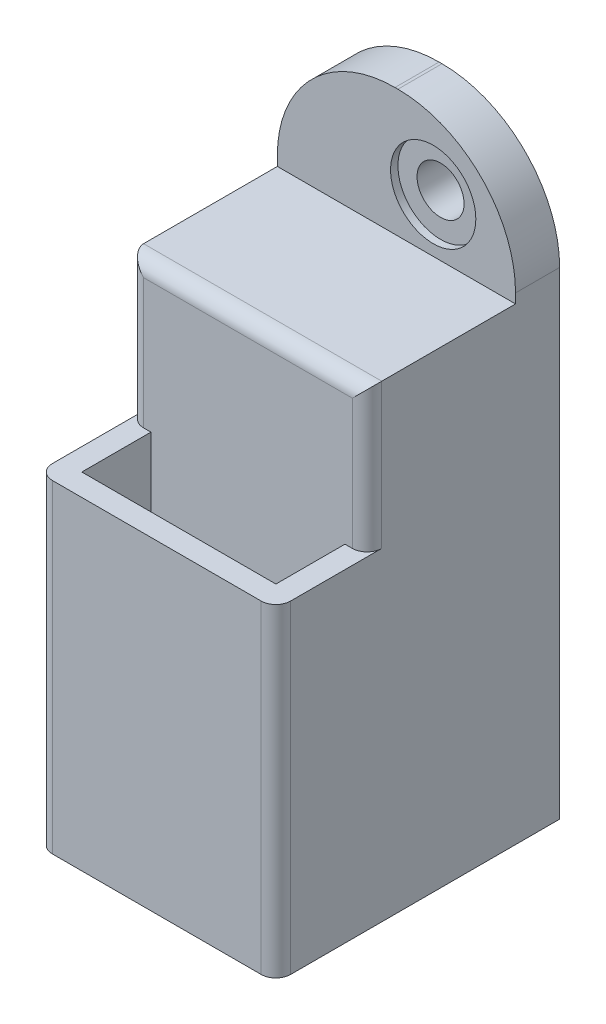
ISO-10303-21;
HEADER;
FILE_DESCRIPTION(('STEP AP214'),'2;1');
FILE_NAME('part.step','',(''),(''),'','','');
FILE_SCHEMA(('AUTOMOTIVE_DESIGN { 1 0 10303 214 1 1 1 1 }'));
ENDSEC;
DATA;
#1=APPLICATION_CONTEXT('core data for automotive mechanical design processes');
#2=APPLICATION_PROTOCOL_DEFINITION('international standard','automotive_design',2000,#1);
#3=PRODUCT_CONTEXT('',#1,'mechanical');
#4=PRODUCT('Part','Part','',(#3));
#5=PRODUCT_RELATED_PRODUCT_CATEGORY('part','',(#4));
#6=PRODUCT_DEFINITION_FORMATION('','',#4);
#7=PRODUCT_DEFINITION_CONTEXT('part definition',#1,'design');
#8=PRODUCT_DEFINITION('design','',#6,#7);
#9=PRODUCT_DEFINITION_SHAPE('','',#8);
#10=(LENGTH_UNIT() NAMED_UNIT(*) SI_UNIT(.MILLI.,.METRE.));
#11=(NAMED_UNIT(*) PLANE_ANGLE_UNIT() SI_UNIT($,.RADIAN.));
#12=(NAMED_UNIT(*) SI_UNIT($,.STERADIAN.) SOLID_ANGLE_UNIT());
#13=UNCERTAINTY_MEASURE_WITH_UNIT(LENGTH_MEASURE(1.E-05),#10,'distance_accuracy_value','');
#14=(GEOMETRIC_REPRESENTATION_CONTEXT(3) GLOBAL_UNCERTAINTY_ASSIGNED_CONTEXT((#13)) GLOBAL_UNIT_ASSIGNED_CONTEXT((#10,
#11,#12)) REPRESENTATION_CONTEXT('',''));
#15=CARTESIAN_POINT('',(0.,0.,0.));
#16=DIRECTION('',(0.,0.,1.));
#17=DIRECTION('',(1.,0.,0.));
#18=AXIS2_PLACEMENT_3D('',#15,#16,#17);
#19=CARTESIAN_POINT('',(0.,0.,-3.5));
#20=DIRECTION('',(0.,0.,-1.));
#21=DIRECTION('',(-1.,0.,0.));
#22=AXIS2_PLACEMENT_3D('',#19,#20,#21);
#23=PLANE('',#22);
#24=DIRECTION('',(0.,-1.,0.));
#25=VECTOR('',#24,1.);
#26=CARTESIAN_POINT('',(0.3,0.,-3.5));
#27=LINE('',#26,#25);
#28=CARTESIAN_POINT('',(0.3,15.,-3.5));
#29=VERTEX_POINT('',#28);
#30=CARTESIAN_POINT('',(0.3,-15.5,-3.5));
#31=VERTEX_POINT('',#30);
#32=EDGE_CURVE('E405',#29,#31,#27,.T.);
#33=ORIENTED_EDGE('',*,*,#32,.F.);
#34=DIRECTION('',(-1.,0.,0.));
#35=VECTOR('',#34,1.);
#36=CARTESIAN_POINT('',(12.9,15.,-3.5));
#37=LINE('',#36,#35);
#38=CARTESIAN_POINT('',(12.9,15.,-3.5));
#39=VERTEX_POINT('',#38);
#40=EDGE_CURVE('E265',#39,#29,#37,.T.);
#41=ORIENTED_EDGE('',*,*,#40,.F.);
#42=DIRECTION('',(0.,1.,0.));
#43=VECTOR('',#42,1.);
#44=CARTESIAN_POINT('',(12.9,11.,-3.5));
#45=LINE('',#44,#43);
#46=CARTESIAN_POINT('',(12.9,-15.5,-3.5));
#47=VERTEX_POINT('',#46);
#48=EDGE_CURVE('E399',#47,#39,#45,.T.);
#49=ORIENTED_EDGE('',*,*,#48,.F.);
#50=DIRECTION('',(1.,0.,0.));
#51=VECTOR('',#50,1.);
#52=CARTESIAN_POINT('',(0.3,-15.5,-3.5));
#53=LINE('',#52,#51);
#54=EDGE_CURVE('E346',#31,#47,#53,.T.);
#55=ORIENTED_EDGE('',*,*,#54,.F.);
#56=EDGE_LOOP('',(#33,#41,#49,#55));
#57=FACE_BOUND('',#56,.T.);
#58=ADVANCED_FACE('F38',(#57),#23,.T.);
#59=CARTESIAN_POINT('',(12.9,11.,-11.6));
#60=DIRECTION('',(1.,0.,0.));
#61=DIRECTION('',(0.,1.,0.));
#62=AXIS2_PLACEMENT_3D('',#59,#60,#61);
#63=PLANE('',#62);
#64=DIRECTION('',(0.,0.,-1.));
#65=VECTOR('',#64,1.);
#66=CARTESIAN_POINT('',(12.9,15.,10.6777995471794));
#67=LINE('',#66,#65);
#68=CARTESIAN_POINT('',(12.9,15.,-11.6));
#69=VERTEX_POINT('',#68);
#70=EDGE_CURVE('E267',#39,#69,#67,.T.);
#71=ORIENTED_EDGE('',*,*,#70,.T.);
#72=DIRECTION('',(0.,1.,0.));
#73=VECTOR('',#72,1.);
#74=CARTESIAN_POINT('',(12.9,11.,-11.6));
#75=LINE('',#74,#73);
#76=CARTESIAN_POINT('',(12.9,-15.5,-11.6));
#77=VERTEX_POINT('',#76);
#78=EDGE_CURVE('E256',#77,#69,#75,.T.);
#79=ORIENTED_EDGE('',*,*,#78,.F.);
#80=DIRECTION('',(0.,0.,-1.));
#81=VECTOR('',#80,1.);
#82=CARTESIAN_POINT('',(12.9,-15.5,-3.5));
#83=LINE('',#82,#81);
#84=EDGE_CURVE('E350',#47,#77,#83,.T.);
#85=ORIENTED_EDGE('',*,*,#84,.F.);
#86=ORIENTED_EDGE('',*,*,#48,.T.);
#87=EDGE_LOOP('',(#71,#79,#85,#86));
#88=FACE_BOUND('',#87,.T.);
#89=ADVANCED_FACE('F611',(#88),#63,.F.);
#90=CARTESIAN_POINT('',(0.3,0.,-11.6));
#91=DIRECTION('',(-1.,0.,0.));
#92=DIRECTION('',(0.,0.,1.));
#93=AXIS2_PLACEMENT_3D('',#90,#91,#92);
#94=PLANE('',#93);
#95=DIRECTION('',(0.,0.,1.));
#96=VECTOR('',#95,1.);
#97=CARTESIAN_POINT('',(0.3,-15.5,-11.6));
#98=LINE('',#97,#96);
#99=CARTESIAN_POINT('',(0.3,-15.5,-11.6));
#100=VERTEX_POINT('',#99);
#101=EDGE_CURVE('E249',#100,#31,#98,.T.);
#102=ORIENTED_EDGE('',*,*,#101,.F.);
#103=DIRECTION('',(0.,-1.,0.));
#104=VECTOR('',#103,1.);
#105=CARTESIAN_POINT('',(0.3,0.,-11.6));
#106=LINE('',#105,#104);
#107=CARTESIAN_POINT('',(0.3,15.,-11.6));
#108=VERTEX_POINT('',#107);
#109=EDGE_CURVE('E244',#108,#100,#106,.T.);
#110=ORIENTED_EDGE('',*,*,#109,.F.);
#111=DIRECTION('',(0.,0.,-1.));
#112=VECTOR('',#111,1.);
#113=CARTESIAN_POINT('',(0.3,15.,10.6777995471794));
#114=LINE('',#113,#112);
#115=EDGE_CURVE('E247',#29,#108,#114,.T.);
#116=ORIENTED_EDGE('',*,*,#115,.F.);
#117=ORIENTED_EDGE('',*,*,#32,.T.);
#118=EDGE_LOOP('',(#102,#110,#116,#117));
#119=FACE_BOUND('',#118,.T.);
#120=ADVANCED_FACE('F246',(#119),#94,.F.);
#121=CARTESIAN_POINT('',(14.7,25.,-8.6));
#122=DIRECTION('',(0.,0.,-1.));
#123=DIRECTION('',(-1.,0.,0.));
#124=AXIS2_PLACEMENT_3D('',#121,#122,#123);
#125=PLANE('',#124);
#126=CARTESIAN_POINT('',(9.1,20.,-8.6));
#127=DIRECTION('',(0.,0.,1.));
#128=DIRECTION('',(1.,0.,0.));
#129=AXIS2_PLACEMENT_3D('',#126,#127,#128);
#130=CIRCLE('',#129,2.9);
#131=CARTESIAN_POINT('',(12.,20.,-8.6));
#132=VERTEX_POINT('',#131);
#133=EDGE_CURVE('E369',#132,#132,#130,.T.);
#134=ORIENTED_EDGE('',*,*,#133,.F.);
#135=EDGE_LOOP('',(#134));
#136=FACE_BOUND('',#135,.T.);
#137=DIRECTION('',(-1.,0.,0.));
#138=VECTOR('',#137,1.);
#139=CARTESIAN_POINT('',(14.7,16.35,-8.6));
#140=LINE('',#139,#138);
#141=CARTESIAN_POINT('',(14.7,16.35,-8.6));
#142=VERTEX_POINT('',#141);
#143=CARTESIAN_POINT('',(-1.5,16.35,-8.6));
#144=VERTEX_POINT('',#143);
#145=EDGE_CURVE('E283',#142,#144,#140,.T.);
#146=ORIENTED_EDGE('',*,*,#145,.F.);
#147=DIRECTION('',(0.,-1.,0.));
#148=VECTOR('',#147,1.);
#149=CARTESIAN_POINT('',(14.7,25.,-8.6));
#150=LINE('',#149,#148);
#151=CARTESIAN_POINT('',(14.7,17.,-8.6));
#152=VERTEX_POINT('',#151);
#153=EDGE_CURVE('E391',#152,#142,#150,.T.);
#154=ORIENTED_EDGE('',*,*,#153,.F.);
#155=CARTESIAN_POINT('',(6.7,17.,-8.6));
#156=DIRECTION('',(0.,0.,-1.));
#157=DIRECTION('',(-1.,0.,0.));
#158=AXIS2_PLACEMENT_3D('',#155,#156,#157);
#159=CIRCLE('',#158,8.);
#160=CARTESIAN_POINT('',(6.7,25.,-8.6));
#161=VERTEX_POINT('',#160);
#162=EDGE_CURVE('E481',#152,#161,#159,.F.);
#163=ORIENTED_EDGE('',*,*,#162,.T.);
#164=DIRECTION('',(1.,0.,0.));
#165=VECTOR('',#164,1.);
#166=CARTESIAN_POINT('',(14.7,25.,-8.6));
#167=LINE('',#166,#165);
#168=CARTESIAN_POINT('',(6.5,25.,-8.6));
#169=VERTEX_POINT('',#168);
#170=EDGE_CURVE('E388',#169,#161,#167,.T.);
#171=ORIENTED_EDGE('',*,*,#170,.F.);
#172=CARTESIAN_POINT('',(6.5,17.,-8.6));
#173=DIRECTION('',(0.,0.,-1.));
#174=DIRECTION('',(-1.,0.,0.));
#175=AXIS2_PLACEMENT_3D('',#172,#173,#174);
#176=CIRCLE('',#175,8.);
#177=CARTESIAN_POINT('',(-1.5,17.,-8.6));
#178=VERTEX_POINT('',#177);
#179=EDGE_CURVE('E478',#169,#178,#176,.F.);
#180=ORIENTED_EDGE('',*,*,#179,.T.);
#181=DIRECTION('',(0.,-1.,0.));
#182=VECTOR('',#181,1.);
#183=CARTESIAN_POINT('',(-1.5,25.,-8.6));
#184=LINE('',#183,#182);
#185=EDGE_CURVE('E395',#178,#144,#184,.T.);
#186=ORIENTED_EDGE('',*,*,#185,.T.);
#187=EDGE_LOOP('',(#146,#154,#163,#171,#180,#186));
#188=FACE_BOUND('',#187,.T.);
#189=ADVANCED_FACE('F538',(#136,#188),#125,.F.);
#190=CARTESIAN_POINT('',(0.,6.5,0.));
#191=DIRECTION('',(1.,0.,0.));
#192=DIRECTION('',(0.,0.,-1.));
#193=AXIS2_PLACEMENT_3D('',#190,#191,#192);
#194=PLANE('',#193);
#195=DIRECTION('',(0.,0.,-1.));
#196=VECTOR('',#195,1.);
#197=CARTESIAN_POINT('',(0.,-9.,1.5));
#198=LINE('',#197,#196);
#199=CARTESIAN_POINT('',(0.,-9.,1.5));
#200=VERTEX_POINT('',#199);
#201=CARTESIAN_POINT('',(0.,-9.,0.));
#202=VERTEX_POINT('',#201);
#203=EDGE_CURVE('E301',#200,#202,#198,.T.);
#204=ORIENTED_EDGE('',*,*,#203,.F.);
#205=DIRECTION('',(0.,1.,0.));
#206=VECTOR('',#205,1.);
#207=CARTESIAN_POINT('',(0.,3.,1.5));
#208=LINE('',#207,#206);
#209=CARTESIAN_POINT('',(0.,6.5,1.5));
#210=VERTEX_POINT('',#209);
#211=EDGE_CURVE('E365',#200,#210,#208,.T.);
#212=ORIENTED_EDGE('',*,*,#211,.T.);
#213=DIRECTION('',(0.,0.,1.));
#214=VECTOR('',#213,1.);
#215=CARTESIAN_POINT('',(0.,6.5,0.));
#216=LINE('',#215,#214);
#217=CARTESIAN_POINT('',(0.,6.5,6.2));
#218=VERTEX_POINT('',#217);
#219=EDGE_CURVE('E255',#210,#218,#216,.T.);
#220=ORIENTED_EDGE('',*,*,#219,.T.);
#221=DIRECTION('',(0.,-1.,0.));
#222=VECTOR('',#221,1.);
#223=CARTESIAN_POINT('',(0.,6.5,6.2));
#224=LINE('',#223,#222);
#225=CARTESIAN_POINT('',(0.,-15.5,6.2));
#226=VERTEX_POINT('',#225);
#227=EDGE_CURVE('E432',#218,#226,#224,.T.);
#228=ORIENTED_EDGE('',*,*,#227,.T.);
#229=DIRECTION('',(0.,0.,-1.));
#230=VECTOR('',#229,1.);
#231=CARTESIAN_POINT('',(0.,-15.5,6.2));
#232=LINE('',#231,#230);
#233=CARTESIAN_POINT('',(0.,-15.5,0.));
#234=VERTEX_POINT('',#233);
#235=EDGE_CURVE('E313',#226,#234,#232,.T.);
#236=ORIENTED_EDGE('',*,*,#235,.T.);
#237=DIRECTION('',(0.,-1.,0.));
#238=VECTOR('',#237,1.);
#239=CARTESIAN_POINT('',(0.,6.5,0.));
#240=LINE('',#239,#238);
#241=EDGE_CURVE('E423',#202,#234,#240,.T.);
#242=ORIENTED_EDGE('',*,*,#241,.F.);
#243=EDGE_LOOP('',(#204,#212,#220,#228,#236,#242));
#244=FACE_BOUND('',#243,.T.);
#245=ADVANCED_FACE('F580',(#244),#194,.T.);
#246=CARTESIAN_POINT('',(13.2,6.5,0.));
#247=DIRECTION('',(-1.,0.,0.));
#248=DIRECTION('',(0.,0.,1.));
#249=AXIS2_PLACEMENT_3D('',#246,#247,#248);
#250=PLANE('',#249);
#251=DIRECTION('',(0.,1.,0.));
#252=VECTOR('',#251,1.);
#253=CARTESIAN_POINT('',(13.2,3.,1.5));
#254=LINE('',#253,#252);
#255=CARTESIAN_POINT('',(13.2,-9.,1.5));
#256=VERTEX_POINT('',#255);
#257=CARTESIAN_POINT('',(13.2,6.5,1.5));
#258=VERTEX_POINT('',#257);
#259=EDGE_CURVE('E362',#256,#258,#254,.T.);
#260=ORIENTED_EDGE('',*,*,#259,.F.);
#261=DIRECTION('',(0.,0.,1.));
#262=VECTOR('',#261,1.);
#263=CARTESIAN_POINT('',(13.2,-9.,0.));
#264=LINE('',#263,#262);
#265=CARTESIAN_POINT('',(13.2,-9.,0.));
#266=VERTEX_POINT('',#265);
#267=EDGE_CURVE('E293',#266,#256,#264,.T.);
#268=ORIENTED_EDGE('',*,*,#267,.F.);
#269=DIRECTION('',(0.,-1.,0.));
#270=VECTOR('',#269,1.);
#271=CARTESIAN_POINT('',(13.2,6.5,0.));
#272=LINE('',#271,#270);
#273=CARTESIAN_POINT('',(13.2,-15.5,0.));
#274=VERTEX_POINT('',#273);
#275=EDGE_CURVE('E426',#266,#274,#272,.T.);
#276=ORIENTED_EDGE('',*,*,#275,.T.);
#277=DIRECTION('',(0.,0.,1.));
#278=VECTOR('',#277,1.);
#279=CARTESIAN_POINT('',(13.2,-15.5,0.));
#280=LINE('',#279,#278);
#281=CARTESIAN_POINT('',(13.2,-15.5,6.2));
#282=VERTEX_POINT('',#281);
#283=EDGE_CURVE('E321',#274,#282,#280,.T.);
#284=ORIENTED_EDGE('',*,*,#283,.T.);
#285=DIRECTION('',(0.,-1.,0.));
#286=VECTOR('',#285,1.);
#287=CARTESIAN_POINT('',(13.2,6.5,6.2));
#288=LINE('',#287,#286);
#289=CARTESIAN_POINT('',(13.2,6.5,6.2));
#290=VERTEX_POINT('',#289);
#291=EDGE_CURVE('E429',#290,#282,#288,.T.);
#292=ORIENTED_EDGE('',*,*,#291,.F.);
#293=DIRECTION('',(0.,0.,-1.));
#294=VECTOR('',#293,1.);
#295=CARTESIAN_POINT('',(13.2,6.5,0.));
#296=LINE('',#295,#294);
#297=EDGE_CURVE('E419',#290,#258,#296,.T.);
#298=ORIENTED_EDGE('',*,*,#297,.T.);
#299=EDGE_LOOP('',(#260,#268,#276,#284,#292,#298));
#300=FACE_BOUND('',#299,.T.);
#301=ADVANCED_FACE('F589',(#300),#250,.T.);
#302=CARTESIAN_POINT('',(9.1,20.,-16.1254833995939));
#303=DIRECTION('',(0.,0.,1.));
#304=DIRECTION('',(1.,0.,0.));
#305=AXIS2_PLACEMENT_3D('',#302,#303,#304);
#306=CYLINDRICAL_SURFACE('',#305,1.6);
#307=CARTESIAN_POINT('',(9.1,20.,-11.6));
#308=DIRECTION('',(0.,0.,1.));
#309=DIRECTION('',(1.,0.,0.));
#310=AXIS2_PLACEMENT_3D('',#307,#308,#309);
#311=CIRCLE('',#310,1.6);
#312=CARTESIAN_POINT('',(10.7,20.,-11.6));
#313=VERTEX_POINT('',#312);
#314=EDGE_CURVE('E380',#313,#313,#311,.F.);
#315=ORIENTED_EDGE('',*,*,#314,.T.);
#316=EDGE_LOOP('',(#315));
#317=FACE_BOUND('',#316,.T.);
#318=CARTESIAN_POINT('',(9.1,20.,-9.1));
#319=DIRECTION('',(0.,0.,1.));
#320=DIRECTION('',(1.,0.,0.));
#321=AXIS2_PLACEMENT_3D('',#318,#319,#320);
#322=CIRCLE('',#321,1.6);
#323=CARTESIAN_POINT('',(10.7,20.,-9.1));
#324=VERTEX_POINT('',#323);
#325=EDGE_CURVE('E374',#324,#324,#322,.F.);
#326=ORIENTED_EDGE('',*,*,#325,.F.);
#327=EDGE_LOOP('',(#326));
#328=FACE_BOUND('',#327,.T.);
#329=ADVANCED_FACE('F626',(#317,#328),#306,.F.);
#330=CARTESIAN_POINT('',(0.,6.5,0.));
#331=DIRECTION('',(0.,1.,0.));
#332=DIRECTION('',(0.,0.,1.));
#333=AXIS2_PLACEMENT_3D('',#330,#331,#332);
#334=PLANE('',#333);
#335=DIRECTION('',(0.,0.,1.));
#336=VECTOR('',#335,1.);
#337=CARTESIAN_POINT('',(-1.5,6.5,-1.5));
#338=LINE('',#337,#336);
#339=CARTESIAN_POINT('',(-1.5,6.5,0.5));
#340=VERTEX_POINT('',#339);
#341=CARTESIAN_POINT('',(-1.5,6.5,6.7));
#342=VERTEX_POINT('',#341);
#343=EDGE_CURVE('E69',#340,#342,#338,.T.);
#344=ORIENTED_EDGE('',*,*,#343,.T.);
#345=CARTESIAN_POINT('',(-0.5,6.5,6.7));
#346=DIRECTION('',(0.,1.,0.));
#347=DIRECTION('',(0.,0.,1.));
#348=AXIS2_PLACEMENT_3D('',#345,#346,#347);
#349=CIRCLE('',#348,1.);
#350=CARTESIAN_POINT('',(-0.5,6.5,7.7));
#351=VERTEX_POINT('',#350);
#352=EDGE_CURVE('E458',#342,#351,#349,.T.);
#353=ORIENTED_EDGE('',*,*,#352,.T.);
#354=DIRECTION('',(1.,0.,0.));
#355=VECTOR('',#354,1.);
#356=CARTESIAN_POINT('',(-1.5,6.5,7.7));
#357=LINE('',#356,#355);
#358=CARTESIAN_POINT('',(13.7,6.5,7.7));
#359=VERTEX_POINT('',#358);
#360=EDGE_CURVE('E437',#351,#359,#357,.T.);
#361=ORIENTED_EDGE('',*,*,#360,.T.);
#362=CARTESIAN_POINT('',(13.7,6.5,6.7));
#363=DIRECTION('',(0.,1.,0.));
#364=DIRECTION('',(0.,0.,1.));
#365=AXIS2_PLACEMENT_3D('',#362,#363,#364);
#366=CIRCLE('',#365,1.);
#367=CARTESIAN_POINT('',(14.7,6.5,6.7));
#368=VERTEX_POINT('',#367);
#369=EDGE_CURVE('E455',#359,#368,#366,.T.);
#370=ORIENTED_EDGE('',*,*,#369,.T.);
#371=DIRECTION('',(0.,0.,-1.));
#372=VECTOR('',#371,1.);
#373=CARTESIAN_POINT('',(14.7,6.5,-1.5));
#374=LINE('',#373,#372);
#375=CARTESIAN_POINT('',(14.7,6.5,0.5));
#376=VERTEX_POINT('',#375);
#377=EDGE_CURVE('E58',#368,#376,#374,.T.);
#378=ORIENTED_EDGE('',*,*,#377,.T.);
#379=CARTESIAN_POINT('',(13.7,6.5,0.5));
#380=DIRECTION('',(0.,1.,0.));
#381=DIRECTION('',(0.,0.,1.));
#382=AXIS2_PLACEMENT_3D('',#379,#380,#381);
#383=CIRCLE('',#382,1.);
#384=CARTESIAN_POINT('',(13.7,6.5,1.5));
#385=VERTEX_POINT('',#384);
#386=EDGE_CURVE('E11',#376,#385,#383,.F.);
#387=ORIENTED_EDGE('',*,*,#386,.T.);
#388=DIRECTION('',(1.,0.,0.));
#389=VECTOR('',#388,1.);
#390=CARTESIAN_POINT('',(14.7,6.5,1.5));
#391=LINE('',#390,#389);
#392=EDGE_CURVE('E381',#258,#385,#391,.T.);
#393=ORIENTED_EDGE('',*,*,#392,.F.);
#394=ORIENTED_EDGE('',*,*,#297,.F.);
#395=DIRECTION('',(1.,0.,0.));
#396=VECTOR('',#395,1.);
#397=CARTESIAN_POINT('',(0.,6.5,6.2));
#398=LINE('',#397,#396);
#399=EDGE_CURVE('E416',#218,#290,#398,.T.);
#400=ORIENTED_EDGE('',*,*,#399,.F.);
#401=ORIENTED_EDGE('',*,*,#219,.F.);
#402=CARTESIAN_POINT('',(-0.5,6.5,1.5));
#403=VERTEX_POINT('',#402);
#404=EDGE_CURVE('E377',#403,#210,#391,.T.);
#405=ORIENTED_EDGE('',*,*,#404,.F.);
#406=CARTESIAN_POINT('',(-0.5,6.5,0.5));
#407=DIRECTION('',(0.,1.,0.));
#408=DIRECTION('',(0.,0.,1.));
#409=AXIS2_PLACEMENT_3D('',#406,#407,#408);
#410=CIRCLE('',#409,1.);
#411=EDGE_CURVE('E48',#403,#340,#410,.F.);
#412=ORIENTED_EDGE('',*,*,#411,.T.);
#413=EDGE_LOOP('',(#344,#353,#361,#370,#378,#387,#393,#394,#400,#401,#405,#412));
#414=FACE_BOUND('',#413,.T.);
#415=ADVANCED_FACE('F574',(#414),#334,.T.);
#416=CARTESIAN_POINT('',(-1.5,6.5,-1.5));
#417=DIRECTION('',(1.,0.,0.));
#418=DIRECTION('',(0.,0.,-1.));
#419=AXIS2_PLACEMENT_3D('',#416,#417,#418);
#420=PLANE('',#419);
#421=ORIENTED_EDGE('',*,*,#343,.F.);
#422=DIRECTION('',(0.,-1.,0.));
#423=VECTOR('',#422,1.);
#424=CARTESIAN_POINT('',(-1.5,16.35,0.5));
#425=LINE('',#424,#423);
#426=CARTESIAN_POINT('',(-1.5,16.35,0.5));
#427=VERTEX_POINT('',#426);
#428=EDGE_CURVE('E500',#340,#427,#425,.F.);
#429=ORIENTED_EDGE('',*,*,#428,.T.);
#430=DIRECTION('',(0.,0.,-1.));
#431=VECTOR('',#430,1.);
#432=CARTESIAN_POINT('',(-1.5,16.35,19.5017360273947));
#433=LINE('',#432,#431);
#434=EDGE_CURVE('E287',#427,#144,#433,.T.);
#435=ORIENTED_EDGE('',*,*,#434,.T.);
#436=ORIENTED_EDGE('',*,*,#185,.F.);
#437=DIRECTION('',(0.,0.,1.));
#438=VECTOR('',#437,1.);
#439=CARTESIAN_POINT('',(-1.5,17.,-1.5));
#440=LINE('',#439,#438);
#441=CARTESIAN_POINT('',(-1.5,17.,-11.6));
#442=VERTEX_POINT('',#441);
#443=EDGE_CURVE('E484',#178,#442,#440,.F.);
#444=ORIENTED_EDGE('',*,*,#443,.T.);
#445=DIRECTION('',(0.,1.,0.));
#446=VECTOR('',#445,1.);
#447=CARTESIAN_POINT('',(-1.5,0.,-11.6));
#448=LINE('',#447,#446);
#449=CARTESIAN_POINT('',(-1.5,-15.5,-11.6));
#450=VERTEX_POINT('',#449);
#451=EDGE_CURVE('E400',#450,#442,#448,.T.);
#452=ORIENTED_EDGE('',*,*,#451,.F.);
#453=DIRECTION('',(0.,0.,-1.));
#454=VECTOR('',#453,1.);
#455=CARTESIAN_POINT('',(-1.5,-15.5,6.7));
#456=LINE('',#455,#454);
#457=CARTESIAN_POINT('',(-1.5,-15.5,6.7));
#458=VERTEX_POINT('',#457);
#459=EDGE_CURVE('E337',#458,#450,#456,.T.);
#460=ORIENTED_EDGE('',*,*,#459,.F.);
#461=DIRECTION('',(0.,-1.,0.));
#462=VECTOR('',#461,1.);
#463=CARTESIAN_POINT('',(-1.5,6.5,6.7));
#464=LINE('',#463,#462);
#465=EDGE_CURVE('E452',#458,#342,#464,.F.);
#466=ORIENTED_EDGE('',*,*,#465,.T.);
#467=EDGE_LOOP('',(#421,#429,#435,#436,#444,#452,#460,#466));
#468=FACE_BOUND('',#467,.T.);
#469=ADVANCED_FACE('F543',(#468),#420,.F.);
#470=CARTESIAN_POINT('',(-1.5,6.5,7.7));
#471=DIRECTION('',(0.,0.,-1.));
#472=DIRECTION('',(-1.,0.,0.));
#473=AXIS2_PLACEMENT_3D('',#470,#471,#472);
#474=PLANE('',#473);
#475=ORIENTED_EDGE('',*,*,#360,.F.);
#476=DIRECTION('',(0.,-1.,0.));
#477=VECTOR('',#476,1.);
#478=CARTESIAN_POINT('',(-0.5,6.5,7.7));
#479=LINE('',#478,#477);
#480=CARTESIAN_POINT('',(-0.5,-15.5,7.7));
#481=VERTEX_POINT('',#480);
#482=EDGE_CURVE('E449',#351,#481,#479,.T.);
#483=ORIENTED_EDGE('',*,*,#482,.T.);
#484=DIRECTION('',(-1.,0.,0.));
#485=VECTOR('',#484,1.);
#486=CARTESIAN_POINT('',(13.7,-15.5,7.7));
#487=LINE('',#486,#485);
#488=CARTESIAN_POINT('',(13.7,-15.5,7.7));
#489=VERTEX_POINT('',#488);
#490=EDGE_CURVE('E329',#489,#481,#487,.T.);
#491=ORIENTED_EDGE('',*,*,#490,.F.);
#492=DIRECTION('',(0.,-1.,0.));
#493=VECTOR('',#492,1.);
#494=CARTESIAN_POINT('',(13.7,6.5,7.7));
#495=LINE('',#494,#493);
#496=EDGE_CURVE('E443',#489,#359,#495,.F.);
#497=ORIENTED_EDGE('',*,*,#496,.T.);
#498=EDGE_LOOP('',(#475,#483,#491,#497));
#499=FACE_BOUND('',#498,.T.);
#500=ADVANCED_FACE('F567',(#499),#474,.F.);
#501=CARTESIAN_POINT('',(14.7,6.5,-1.5));
#502=DIRECTION('',(-1.,0.,0.));
#503=DIRECTION('',(0.,0.,1.));
#504=AXIS2_PLACEMENT_3D('',#501,#502,#503);
#505=PLANE('',#504);
#506=DIRECTION('',(0.,0.,-1.));
#507=VECTOR('',#506,1.);
#508=CARTESIAN_POINT('',(14.7,16.35,19.5017360273947));
#509=LINE('',#508,#507);
#510=CARTESIAN_POINT('',(14.7,16.35,0.5));
#511=VERTEX_POINT('',#510);
#512=EDGE_CURVE('E288',#511,#142,#509,.T.);
#513=ORIENTED_EDGE('',*,*,#512,.F.);
#514=DIRECTION('',(0.,1.,0.));
#515=VECTOR('',#514,1.);
#516=CARTESIAN_POINT('',(14.7,6.5,0.5));
#517=LINE('',#516,#515);
#518=EDGE_CURVE('E503',#511,#376,#517,.F.);
#519=ORIENTED_EDGE('',*,*,#518,.T.);
#520=ORIENTED_EDGE('',*,*,#377,.F.);
#521=DIRECTION('',(0.,-1.,0.));
#522=VECTOR('',#521,1.);
#523=CARTESIAN_POINT('',(14.7,6.5,6.7));
#524=LINE('',#523,#522);
#525=CARTESIAN_POINT('',(14.7,-15.5,6.7));
#526=VERTEX_POINT('',#525);
#527=EDGE_CURVE('E461',#368,#526,#524,.T.);
#528=ORIENTED_EDGE('',*,*,#527,.T.);
#529=DIRECTION('',(0.,0.,1.));
#530=VECTOR('',#529,1.);
#531=CARTESIAN_POINT('',(14.7,-15.5,-11.6));
#532=LINE('',#531,#530);
#533=CARTESIAN_POINT('',(14.7,-15.5,-11.6));
#534=VERTEX_POINT('',#533);
#535=EDGE_CURVE('E358',#534,#526,#532,.T.);
#536=ORIENTED_EDGE('',*,*,#535,.F.);
#537=DIRECTION('',(0.,-1.,0.));
#538=VECTOR('',#537,1.);
#539=CARTESIAN_POINT('',(14.7,12.,-11.6));
#540=LINE('',#539,#538);
#541=CARTESIAN_POINT('',(14.7,17.,-11.6));
#542=VERTEX_POINT('',#541);
#543=EDGE_CURVE('E404',#542,#534,#540,.T.);
#544=ORIENTED_EDGE('',*,*,#543,.F.);
#545=DIRECTION('',(0.,0.,-1.));
#546=VECTOR('',#545,1.);
#547=CARTESIAN_POINT('',(14.7,17.,-1.5));
#548=LINE('',#547,#546);
#549=EDGE_CURVE('E475',#542,#152,#548,.F.);
#550=ORIENTED_EDGE('',*,*,#549,.T.);
#551=ORIENTED_EDGE('',*,*,#153,.T.);
#552=EDGE_LOOP('',(#513,#519,#520,#528,#536,#544,#550,#551));
#553=FACE_BOUND('',#552,.T.);
#554=ADVANCED_FACE('F530',(#553),#505,.F.);
#555=CARTESIAN_POINT('',(0.,6.5,6.2));
#556=DIRECTION('',(0.,0.,-1.));
#557=DIRECTION('',(-1.,0.,0.));
#558=AXIS2_PLACEMENT_3D('',#555,#556,#557);
#559=PLANE('',#558);
#560=ORIENTED_EDGE('',*,*,#291,.T.);
#561=DIRECTION('',(-1.,0.,0.));
#562=VECTOR('',#561,1.);
#563=CARTESIAN_POINT('',(13.2,-15.5,6.2));
#564=LINE('',#563,#562);
#565=EDGE_CURVE('E309',#282,#226,#564,.T.);
#566=ORIENTED_EDGE('',*,*,#565,.T.);
#567=ORIENTED_EDGE('',*,*,#227,.F.);
#568=ORIENTED_EDGE('',*,*,#399,.T.);
#569=EDGE_LOOP('',(#560,#566,#567,#568));
#570=FACE_BOUND('',#569,.T.);
#571=ADVANCED_FACE('F593',(#570),#559,.T.);
#572=CARTESIAN_POINT('',(0.,6.5,0.));
#573=DIRECTION('',(0.,0.,1.));
#574=DIRECTION('',(1.,0.,0.));
#575=AXIS2_PLACEMENT_3D('',#572,#573,#574);
#576=PLANE('',#575);
#577=DIRECTION('',(1.,0.,0.));
#578=VECTOR('',#577,1.);
#579=CARTESIAN_POINT('',(0.,-9.,0.));
#580=LINE('',#579,#578);
#581=EDGE_CURVE('E305',#202,#266,#580,.T.);
#582=ORIENTED_EDGE('',*,*,#581,.F.);
#583=ORIENTED_EDGE('',*,*,#241,.T.);
#584=DIRECTION('',(1.,0.,0.));
#585=VECTOR('',#584,1.);
#586=CARTESIAN_POINT('',(0.,-15.5,0.));
#587=LINE('',#586,#585);
#588=EDGE_CURVE('E317',#234,#274,#587,.T.);
#589=ORIENTED_EDGE('',*,*,#588,.T.);
#590=ORIENTED_EDGE('',*,*,#275,.F.);
#591=EDGE_LOOP('',(#582,#583,#589,#590));
#592=FACE_BOUND('',#591,.T.);
#593=ADVANCED_FACE('F598',(#592),#576,.T.);
#594=CARTESIAN_POINT('',(0.,0.,-11.6));
#595=DIRECTION('',(0.,0.,1.));
#596=DIRECTION('',(1.,0.,0.));
#597=AXIS2_PLACEMENT_3D('',#594,#595,#596);
#598=PLANE('',#597);
#599=ORIENTED_EDGE('',*,*,#314,.F.);
#600=EDGE_LOOP('',(#599));
#601=FACE_BOUND('',#600,.T.);
#602=ORIENTED_EDGE('',*,*,#78,.T.);
#603=DIRECTION('',(1.,0.,0.));
#604=VECTOR('',#603,1.);
#605=CARTESIAN_POINT('',(12.9,15.,-11.6));
#606=LINE('',#605,#604);
#607=EDGE_CURVE('E263',#108,#69,#606,.T.);
#608=ORIENTED_EDGE('',*,*,#607,.F.);
#609=ORIENTED_EDGE('',*,*,#109,.T.);
#610=DIRECTION('',(1.,0.,0.));
#611=VECTOR('',#610,1.);
#612=CARTESIAN_POINT('',(-1.5,-15.5,-11.6));
#613=LINE('',#612,#611);
#614=EDGE_CURVE('E341',#450,#100,#613,.T.);
#615=ORIENTED_EDGE('',*,*,#614,.F.);
#616=ORIENTED_EDGE('',*,*,#451,.T.);
#617=CARTESIAN_POINT('',(6.5,17.,-11.6));
#618=DIRECTION('',(0.,0.,1.));
#619=DIRECTION('',(1.,0.,0.));
#620=AXIS2_PLACEMENT_3D('',#617,#618,#619);
#621=CIRCLE('',#620,8.);
#622=CARTESIAN_POINT('',(6.5,25.,-11.6));
#623=VERTEX_POINT('',#622);
#624=EDGE_CURVE('E470',#442,#623,#621,.F.);
#625=ORIENTED_EDGE('',*,*,#624,.T.);
#626=DIRECTION('',(-1.,0.,0.));
#627=VECTOR('',#626,1.);
#628=CARTESIAN_POINT('',(14.7,25.,-11.6));
#629=LINE('',#628,#627);
#630=CARTESIAN_POINT('',(6.7,25.,-11.6));
#631=VERTEX_POINT('',#630);
#632=EDGE_CURVE('E385',#631,#623,#629,.T.);
#633=ORIENTED_EDGE('',*,*,#632,.F.);
#634=CARTESIAN_POINT('',(6.7,17.,-11.6));
#635=DIRECTION('',(0.,0.,1.));
#636=DIRECTION('',(1.,0.,0.));
#637=AXIS2_PLACEMENT_3D('',#634,#635,#636);
#638=CIRCLE('',#637,8.);
#639=EDGE_CURVE('E472',#631,#542,#638,.F.);
#640=ORIENTED_EDGE('',*,*,#639,.T.);
#641=ORIENTED_EDGE('',*,*,#543,.T.);
#642=DIRECTION('',(1.,0.,0.));
#643=VECTOR('',#642,1.);
#644=CARTESIAN_POINT('',(12.9,-15.5,-11.6));
#645=LINE('',#644,#643);
#646=EDGE_CURVE('E354',#77,#534,#645,.T.);
#647=ORIENTED_EDGE('',*,*,#646,.F.);
#648=EDGE_LOOP('',(#602,#608,#609,#615,#616,#625,#633,#640,#641,#647));
#649=FACE_BOUND('',#648,.T.);
#650=ADVANCED_FACE('F269',(#601,#649),#598,.F.);
#651=CARTESIAN_POINT('',(0.,25.,0.));
#652=DIRECTION('',(0.,-1.,0.));
#653=DIRECTION('',(1.,0.,0.));
#654=AXIS2_PLACEMENT_3D('',#651,#652,#653);
#655=PLANE('',#654);
#656=ORIENTED_EDGE('',*,*,#170,.T.);
#657=DIRECTION('',(0.,0.,-1.));
#658=VECTOR('',#657,1.);
#659=CARTESIAN_POINT('',(6.7,25.,0.));
#660=LINE('',#659,#658);
#661=EDGE_CURVE('E467',#161,#631,#660,.T.);
#662=ORIENTED_EDGE('',*,*,#661,.T.);
#663=ORIENTED_EDGE('',*,*,#632,.T.);
#664=DIRECTION('',(0.,0.,1.));
#665=VECTOR('',#664,1.);
#666=CARTESIAN_POINT('',(6.5,25.,0.));
#667=LINE('',#666,#665);
#668=EDGE_CURVE('E464',#623,#169,#667,.T.);
#669=ORIENTED_EDGE('',*,*,#668,.T.);
#670=EDGE_LOOP('',(#656,#662,#663,#669));
#671=FACE_BOUND('',#670,.T.);
#672=ADVANCED_FACE('F550',(#671),#655,.F.);
#673=CARTESIAN_POINT('',(0.,0.,1.5));
#674=DIRECTION('',(0.,0.,1.));
#675=DIRECTION('',(1.,0.,0.));
#676=AXIS2_PLACEMENT_3D('',#673,#674,#675);
#677=PLANE('',#676);
#678=DIRECTION('',(-1.,0.,0.));
#679=VECTOR('',#678,1.);
#680=CARTESIAN_POINT('',(-1.5,15.35,1.5));
#681=LINE('',#680,#679);
#682=CARTESIAN_POINT('',(13.7,15.35,1.5));
#683=VERTEX_POINT('',#682);
#684=CARTESIAN_POINT('',(-0.5,15.35,1.5));
#685=VERTEX_POINT('',#684);
#686=EDGE_CURVE('E490',#683,#685,#681,.T.);
#687=ORIENTED_EDGE('',*,*,#686,.T.);
#688=DIRECTION('',(0.,-1.,0.));
#689=VECTOR('',#688,1.);
#690=CARTESIAN_POINT('',(-0.5,6.5,1.5));
#691=LINE('',#690,#689);
#692=EDGE_CURVE('E494',#685,#403,#691,.T.);
#693=ORIENTED_EDGE('',*,*,#692,.T.);
#694=ORIENTED_EDGE('',*,*,#404,.T.);
#695=ORIENTED_EDGE('',*,*,#211,.F.);
#696=DIRECTION('',(-1.,0.,0.));
#697=VECTOR('',#696,1.);
#698=CARTESIAN_POINT('',(13.2,-9.,1.5));
#699=LINE('',#698,#697);
#700=EDGE_CURVE('E297',#256,#200,#699,.T.);
#701=ORIENTED_EDGE('',*,*,#700,.F.);
#702=ORIENTED_EDGE('',*,*,#259,.T.);
#703=ORIENTED_EDGE('',*,*,#392,.T.);
#704=DIRECTION('',(0.,1.,0.));
#705=VECTOR('',#704,1.);
#706=CARTESIAN_POINT('',(13.7,16.35,1.5));
#707=LINE('',#706,#705);
#708=EDGE_CURVE('E487',#385,#683,#707,.T.);
#709=ORIENTED_EDGE('',*,*,#708,.T.);
#710=EDGE_LOOP('',(#687,#693,#694,#695,#701,#702,#703,#709));
#711=FACE_BOUND('',#710,.T.);
#712=ADVANCED_FACE('F520',(#711),#677,.T.);
#713=CARTESIAN_POINT('',(9.1,20.,-9.1));
#714=DIRECTION('',(0.,0.,1.));
#715=DIRECTION('',(1.,0.,0.));
#716=AXIS2_PLACEMENT_3D('',#713,#714,#715);
#717=PLANE('',#716);
#718=CARTESIAN_POINT('',(9.1,20.,-9.1));
#719=DIRECTION('',(0.,0.,1.));
#720=DIRECTION('',(1.,0.,0.));
#721=AXIS2_PLACEMENT_3D('',#718,#719,#720);
#722=CIRCLE('',#721,2.9);
#723=CARTESIAN_POINT('',(12.,20.,-9.1));
#724=VERTEX_POINT('',#723);
#725=EDGE_CURVE('E370',#724,#724,#722,.T.);
#726=ORIENTED_EDGE('',*,*,#725,.T.);
#727=EDGE_LOOP('',(#726));
#728=FACE_BOUND('',#727,.T.);
#729=ORIENTED_EDGE('',*,*,#325,.T.);
#730=EDGE_LOOP('',(#729));
#731=FACE_BOUND('',#730,.T.);
#732=ADVANCED_FACE('F632',(#728,#731),#717,.T.);
#733=CARTESIAN_POINT('',(9.1,20.,-9.1));
#734=DIRECTION('',(0.,0.,1.));
#735=DIRECTION('',(1.,0.,0.));
#736=AXIS2_PLACEMENT_3D('',#733,#734,#735);
#737=CYLINDRICAL_SURFACE('',#736,2.9);
#738=ORIENTED_EDGE('',*,*,#725,.F.);
#739=EDGE_LOOP('',(#738));
#740=FACE_BOUND('',#739,.T.);
#741=ORIENTED_EDGE('',*,*,#133,.T.);
#742=EDGE_LOOP('',(#741));
#743=FACE_BOUND('',#742,.T.);
#744=ADVANCED_FACE('F633',(#740,#743),#737,.F.);
#745=CARTESIAN_POINT('',(-0.5,6.5,6.7));
#746=DIRECTION('',(0.,-1.,0.));
#747=DIRECTION('',(0.,0.,-1.));
#748=AXIS2_PLACEMENT_3D('',#745,#746,#747);
#749=CYLINDRICAL_SURFACE('',#748,1.);
#750=ORIENTED_EDGE('',*,*,#352,.F.);
#751=ORIENTED_EDGE('',*,*,#465,.F.);
#752=CARTESIAN_POINT('',(-0.5,-15.5,6.7));
#753=DIRECTION('',(0.,-1.,0.));
#754=DIRECTION('',(0.,0.,-1.));
#755=AXIS2_PLACEMENT_3D('',#752,#753,#754);
#756=CIRCLE('',#755,1.);
#757=EDGE_CURVE('E333',#481,#458,#756,.T.);
#758=ORIENTED_EDGE('',*,*,#757,.F.);
#759=ORIENTED_EDGE('',*,*,#482,.F.);
#760=EDGE_LOOP('',(#750,#751,#758,#759));
#761=FACE_BOUND('',#760,.T.);
#762=ADVANCED_FACE('F573',(#761),#749,.T.);
#763=CARTESIAN_POINT('',(13.7,6.5,6.7));
#764=DIRECTION('',(0.,-1.,0.));
#765=DIRECTION('',(0.,0.,-1.));
#766=AXIS2_PLACEMENT_3D('',#763,#764,#765);
#767=CYLINDRICAL_SURFACE('',#766,1.);
#768=ORIENTED_EDGE('',*,*,#369,.F.);
#769=ORIENTED_EDGE('',*,*,#496,.F.);
#770=CARTESIAN_POINT('',(13.7,-15.5,6.7));
#771=DIRECTION('',(0.,-1.,0.));
#772=DIRECTION('',(0.,0.,-1.));
#773=AXIS2_PLACEMENT_3D('',#770,#771,#772);
#774=CIRCLE('',#773,1.);
#775=EDGE_CURVE('E325',#526,#489,#774,.T.);
#776=ORIENTED_EDGE('',*,*,#775,.F.);
#777=ORIENTED_EDGE('',*,*,#527,.F.);
#778=EDGE_LOOP('',(#768,#769,#776,#777));
#779=FACE_BOUND('',#778,.T.);
#780=ADVANCED_FACE('F563',(#779),#767,.T.);
#781=CARTESIAN_POINT('',(6.7,17.,0.));
#782=DIRECTION('',(0.,0.,-1.));
#783=DIRECTION('',(-1.,0.,0.));
#784=AXIS2_PLACEMENT_3D('',#781,#782,#783);
#785=CYLINDRICAL_SURFACE('',#784,8.);
#786=ORIENTED_EDGE('',*,*,#162,.F.);
#787=ORIENTED_EDGE('',*,*,#549,.F.);
#788=ORIENTED_EDGE('',*,*,#639,.F.);
#789=ORIENTED_EDGE('',*,*,#661,.F.);
#790=EDGE_LOOP('',(#786,#787,#788,#789));
#791=FACE_BOUND('',#790,.T.);
#792=ADVANCED_FACE('F553',(#791),#785,.T.);
#793=CARTESIAN_POINT('',(6.5,17.,0.));
#794=DIRECTION('',(0.,0.,1.));
#795=DIRECTION('',(1.,0.,0.));
#796=AXIS2_PLACEMENT_3D('',#793,#794,#795);
#797=CYLINDRICAL_SURFACE('',#796,8.);
#798=ORIENTED_EDGE('',*,*,#624,.F.);
#799=ORIENTED_EDGE('',*,*,#443,.F.);
#800=ORIENTED_EDGE('',*,*,#179,.F.);
#801=ORIENTED_EDGE('',*,*,#668,.F.);
#802=EDGE_LOOP('',(#798,#799,#800,#801));
#803=FACE_BOUND('',#802,.T.);
#804=ADVANCED_FACE('F546',(#803),#797,.T.);
#805=CARTESIAN_POINT('',(13.7,-15.5,6.7));
#806=DIRECTION('',(0.,-1.,0.));
#807=DIRECTION('',(0.,0.,-1.));
#808=AXIS2_PLACEMENT_3D('',#805,#806,#807);
#809=PLANE('',#808);
#810=ORIENTED_EDGE('',*,*,#775,.T.);
#811=ORIENTED_EDGE('',*,*,#490,.T.);
#812=ORIENTED_EDGE('',*,*,#757,.T.);
#813=ORIENTED_EDGE('',*,*,#459,.T.);
#814=ORIENTED_EDGE('',*,*,#614,.T.);
#815=ORIENTED_EDGE('',*,*,#101,.T.);
#816=ORIENTED_EDGE('',*,*,#54,.T.);
#817=ORIENTED_EDGE('',*,*,#84,.T.);
#818=ORIENTED_EDGE('',*,*,#646,.T.);
#819=ORIENTED_EDGE('',*,*,#535,.T.);
#820=EDGE_LOOP('',(#810,#811,#812,#813,#814,#815,#816,#817,#818,#819));
#821=FACE_BOUND('',#820,.T.);
#822=ORIENTED_EDGE('',*,*,#235,.F.);
#823=ORIENTED_EDGE('',*,*,#565,.F.);
#824=ORIENTED_EDGE('',*,*,#283,.F.);
#825=ORIENTED_EDGE('',*,*,#588,.F.);
#826=EDGE_LOOP('',(#822,#823,#824,#825));
#827=FACE_BOUND('',#826,.T.);
#828=ADVANCED_FACE('F559',(#821,#827),#809,.T.);
#829=CARTESIAN_POINT('',(0.,-9.,0.));
#830=DIRECTION('',(0.,-1.,0.));
#831=DIRECTION('',(0.,0.,-1.));
#832=AXIS2_PLACEMENT_3D('',#829,#830,#831);
#833=PLANE('',#832);
#834=ORIENTED_EDGE('',*,*,#267,.T.);
#835=ORIENTED_EDGE('',*,*,#700,.T.);
#836=ORIENTED_EDGE('',*,*,#203,.T.);
#837=ORIENTED_EDGE('',*,*,#581,.T.);
#838=EDGE_LOOP('',(#834,#835,#836,#837));
#839=FACE_BOUND('',#838,.T.);
#840=ADVANCED_FACE('F584',(#839),#833,.T.);
#841=CARTESIAN_POINT('',(14.7,16.35,19.5017360273947));
#842=DIRECTION('',(0.,-1.,0.));
#843=DIRECTION('',(1.,0.,0.));
#844=AXIS2_PLACEMENT_3D('',#841,#842,#843);
#845=PLANE('',#844);
#846=ORIENTED_EDGE('',*,*,#434,.F.);
#847=DIRECTION('',(-1.,0.,0.));
#848=VECTOR('',#847,1.);
#849=CARTESIAN_POINT('',(14.7,16.35,0.5));
#850=LINE('',#849,#848);
#851=EDGE_CURVE('E497',#427,#511,#850,.F.);
#852=ORIENTED_EDGE('',*,*,#851,.T.);
#853=ORIENTED_EDGE('',*,*,#512,.T.);
#854=ORIENTED_EDGE('',*,*,#145,.T.);
#855=EDGE_LOOP('',(#846,#852,#853,#854));
#856=FACE_BOUND('',#855,.T.);
#857=ADVANCED_FACE('F536',(#856),#845,.F.);
#858=CARTESIAN_POINT('',(12.9,15.,10.6777995471794));
#859=DIRECTION('',(0.,1.,0.));
#860=DIRECTION('',(0.,0.,1.));
#861=AXIS2_PLACEMENT_3D('',#858,#859,#860);
#862=PLANE('',#861);
#863=ORIENTED_EDGE('',*,*,#40,.T.);
#864=ORIENTED_EDGE('',*,*,#115,.T.);
#865=ORIENTED_EDGE('',*,*,#607,.T.);
#866=ORIENTED_EDGE('',*,*,#70,.F.);
#867=EDGE_LOOP('',(#863,#864,#865,#866));
#868=FACE_BOUND('',#867,.T.);
#869=ADVANCED_FACE('F261',(#868),#862,.F.);
#870=CARTESIAN_POINT('',(13.7,0.,0.5));
#871=DIRECTION('',(0.,-1.,0.));
#872=DIRECTION('',(0.,0.,-1.));
#873=AXIS2_PLACEMENT_3D('',#870,#871,#872);
#874=CYLINDRICAL_SURFACE('',#873,1.);
#875=ORIENTED_EDGE('',*,*,#386,.F.);
#876=ORIENTED_EDGE('',*,*,#518,.F.);
#877=CARTESIAN_POINT('',(13.7,15.35,0.5));
#878=DIRECTION('',(0.707106781186548,-0.707106781186547,0.));
#879=DIRECTION('',(-0.707106781186547,-0.707106781186548,0.));
#880=AXIS2_PLACEMENT_3D('',#877,#878,#879);
#881=ELLIPSE('',#880,1.4142135623731,1.);
#882=EDGE_CURVE('E42',#683,#511,#881,.F.);
#883=ORIENTED_EDGE('',*,*,#882,.F.);
#884=ORIENTED_EDGE('',*,*,#708,.F.);
#885=EDGE_LOOP('',(#875,#876,#883,#884));
#886=FACE_BOUND('',#885,.T.);
#887=ADVANCED_FACE('F40',(#886),#874,.T.);
#888=CARTESIAN_POINT('',(-0.5,0.,0.5));
#889=DIRECTION('',(0.,1.,0.));
#890=DIRECTION('',(0.,0.,1.));
#891=AXIS2_PLACEMENT_3D('',#888,#889,#890);
#892=CYLINDRICAL_SURFACE('',#891,1.);
#893=ORIENTED_EDGE('',*,*,#411,.F.);
#894=ORIENTED_EDGE('',*,*,#692,.F.);
#895=CARTESIAN_POINT('',(-0.5,15.35,0.5));
#896=DIRECTION('',(0.707106781186547,0.707106781186548,0.));
#897=DIRECTION('',(-0.707106781186548,0.707106781186547,0.));
#898=AXIS2_PLACEMENT_3D('',#895,#896,#897);
#899=ELLIPSE('',#898,1.41421356237309,1.);
#900=EDGE_CURVE('E278',#427,#685,#899,.T.);
#901=ORIENTED_EDGE('',*,*,#900,.F.);
#902=ORIENTED_EDGE('',*,*,#428,.F.);
#903=EDGE_LOOP('',(#893,#894,#901,#902));
#904=FACE_BOUND('',#903,.T.);
#905=ADVANCED_FACE('F517',(#904),#892,.T.);
#906=CARTESIAN_POINT('',(0.,15.35,0.5));
#907=DIRECTION('',(1.,0.,0.));
#908=DIRECTION('',(0.,1.,0.));
#909=AXIS2_PLACEMENT_3D('',#906,#907,#908);
#910=CYLINDRICAL_SURFACE('',#909,1.);
#911=ORIENTED_EDGE('',*,*,#882,.T.);
#912=ORIENTED_EDGE('',*,*,#851,.F.);
#913=ORIENTED_EDGE('',*,*,#900,.T.);
#914=ORIENTED_EDGE('',*,*,#686,.F.);
#915=EDGE_LOOP('',(#911,#912,#913,#914));
#916=FACE_BOUND('',#915,.T.);
#917=ADVANCED_FACE('F513',(#916),#910,.T.);
#918=CLOSED_SHELL('',(#58,#89,#120,#189,#245,#301,#329,#415,#469,#500,#554,#571,#593,#650,#672,
#712,#732,#744,#762,#780,#792,#804,#828,#840,#857,#869,#887,#905,#917));
#919=MANIFOLD_SOLID_BREP('B2',#918);
#920=ADVANCED_BREP_SHAPE_REPRESENTATION('',(#18,#919),#14);
#921=SHAPE_DEFINITION_REPRESENTATION(#9,#920);
ENDSEC;
END-ISO-10303-21;
